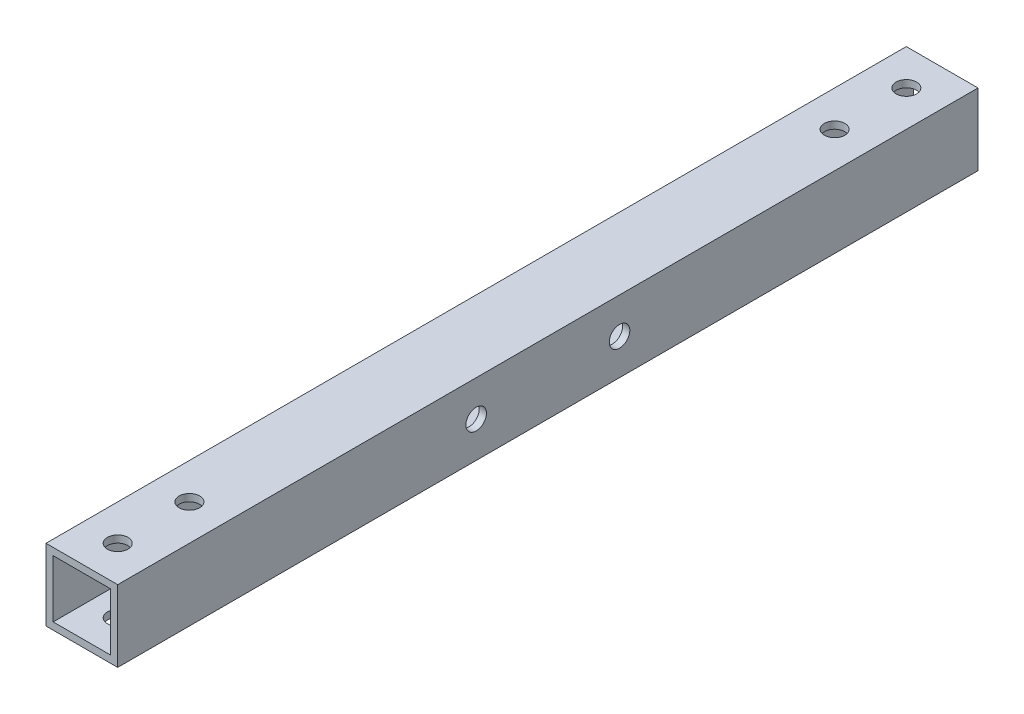
ISO-10303-21;
HEADER;
FILE_DESCRIPTION(('STEP AP214'),'2;1');
FILE_NAME('part.step','',(''),(''),'','','');
FILE_SCHEMA(('AUTOMOTIVE_DESIGN { 1 0 10303 214 1 1 1 1 }'));
ENDSEC;
DATA;
#1=APPLICATION_CONTEXT('core data for automotive mechanical design processes');
#2=APPLICATION_PROTOCOL_DEFINITION('international standard','automotive_design',2000,#1);
#3=PRODUCT_CONTEXT('',#1,'mechanical');
#4=PRODUCT('Part','Part','',(#3));
#5=PRODUCT_RELATED_PRODUCT_CATEGORY('part','',(#4));
#6=PRODUCT_DEFINITION_FORMATION('','',#4);
#7=PRODUCT_DEFINITION_CONTEXT('part definition',#1,'design');
#8=PRODUCT_DEFINITION('design','',#6,#7);
#9=PRODUCT_DEFINITION_SHAPE('','',#8);
#10=(LENGTH_UNIT() NAMED_UNIT(*) SI_UNIT(.MILLI.,.METRE.));
#11=(NAMED_UNIT(*) PLANE_ANGLE_UNIT() SI_UNIT($,.RADIAN.));
#12=(NAMED_UNIT(*) SI_UNIT($,.STERADIAN.) SOLID_ANGLE_UNIT());
#13=UNCERTAINTY_MEASURE_WITH_UNIT(LENGTH_MEASURE(1.E-05),#10,'distance_accuracy_value','');
#14=(GEOMETRIC_REPRESENTATION_CONTEXT(3) GLOBAL_UNCERTAINTY_ASSIGNED_CONTEXT((#13)) GLOBAL_UNIT_ASSIGNED_CONTEXT((#10,
#11,#12)) REPRESENTATION_CONTEXT('',''));
#15=CARTESIAN_POINT('',(0.,0.,0.));
#16=DIRECTION('',(0.,0.,1.));
#17=DIRECTION('',(1.,0.,0.));
#18=AXIS2_PLACEMENT_3D('',#15,#16,#17);
#19=CARTESIAN_POINT('',(-7.5,7.5,180.));
#20=DIRECTION('',(0.,-1.,0.));
#21=DIRECTION('',(0.,0.,-1.));
#22=AXIS2_PLACEMENT_3D('',#19,#20,#21);
#23=PLANE('',#22);
#24=CARTESIAN_POINT('',(0.,7.5,7.5));
#25=DIRECTION('',(0.,1.,0.));
#26=DIRECTION('',(0.,0.,1.));
#27=AXIS2_PLACEMENT_3D('',#24,#25,#26);
#28=CIRCLE('',#27,2.15);
#29=CARTESIAN_POINT('',(0.,7.5,9.65));
#30=VERTEX_POINT('',#29);
#31=EDGE_CURVE('E296',#30,#30,#28,.T.);
#32=ORIENTED_EDGE('',*,*,#31,.F.);
#33=EDGE_LOOP('',(#32));
#34=FACE_BOUND('',#33,.T.);
#35=CARTESIAN_POINT('',(0.,7.5,22.5));
#36=DIRECTION('',(0.,1.,0.));
#37=DIRECTION('',(0.,0.,1.));
#38=AXIS2_PLACEMENT_3D('',#35,#36,#37);
#39=CIRCLE('',#38,2.15);
#40=CARTESIAN_POINT('',(0.,7.5,24.65));
#41=VERTEX_POINT('',#40);
#42=EDGE_CURVE('E299',#41,#41,#39,.T.);
#43=ORIENTED_EDGE('',*,*,#42,.F.);
#44=EDGE_LOOP('',(#43));
#45=FACE_BOUND('',#44,.T.);
#46=DIRECTION('',(-1.,0.,0.));
#47=VECTOR('',#46,1.);
#48=CARTESIAN_POINT('',(-7.5,7.5,0.));
#49=LINE('',#48,#47);
#50=CARTESIAN_POINT('',(7.5,7.5,0.));
#51=VERTEX_POINT('',#50);
#52=CARTESIAN_POINT('',(-7.5,7.5,0.));
#53=VERTEX_POINT('',#52);
#54=EDGE_CURVE('E179',#51,#53,#49,.T.);
#55=ORIENTED_EDGE('',*,*,#54,.T.);
#56=DIRECTION('',(0.,0.,-1.));
#57=VECTOR('',#56,1.);
#58=CARTESIAN_POINT('',(-7.5,7.5,180.));
#59=LINE('',#58,#57);
#60=CARTESIAN_POINT('',(-7.5,7.5,180.));
#61=VERTEX_POINT('',#60);
#62=EDGE_CURVE('E68',#61,#53,#59,.T.);
#63=ORIENTED_EDGE('',*,*,#62,.F.);
#64=DIRECTION('',(-1.,0.,0.));
#65=VECTOR('',#64,1.);
#66=CARTESIAN_POINT('',(-7.5,7.5,180.));
#67=LINE('',#66,#65);
#68=CARTESIAN_POINT('',(7.5,7.5,180.));
#69=VERTEX_POINT('',#68);
#70=EDGE_CURVE('E169',#69,#61,#67,.T.);
#71=ORIENTED_EDGE('',*,*,#70,.F.);
#72=DIRECTION('',(0.,0.,-1.));
#73=VECTOR('',#72,1.);
#74=CARTESIAN_POINT('',(7.5,7.5,180.));
#75=LINE('',#74,#73);
#76=EDGE_CURVE('E12',#69,#51,#75,.T.);
#77=ORIENTED_EDGE('',*,*,#76,.T.);
#78=EDGE_LOOP('',(#55,#63,#71,#77));
#79=FACE_BOUND('',#78,.T.);
#80=CARTESIAN_POINT('',(0.,7.5,172.5));
#81=DIRECTION('',(0.,1.,0.));
#82=DIRECTION('',(0.,0.,1.));
#83=AXIS2_PLACEMENT_3D('',#80,#81,#82);
#84=CIRCLE('',#83,2.15000000000002);
#85=CARTESIAN_POINT('',(0.,7.5,174.65));
#86=VERTEX_POINT('',#85);
#87=EDGE_CURVE('E307',#86,#86,#84,.F.);
#88=ORIENTED_EDGE('',*,*,#87,.T.);
#89=EDGE_LOOP('',(#88));
#90=FACE_BOUND('',#89,.T.);
#91=CARTESIAN_POINT('',(0.,7.5,157.5));
#92=DIRECTION('',(0.,1.,0.));
#93=DIRECTION('',(0.,0.,1.));
#94=AXIS2_PLACEMENT_3D('',#91,#92,#93);
#95=CIRCLE('',#94,2.14999999999998);
#96=CARTESIAN_POINT('',(0.,7.5,159.65));
#97=VERTEX_POINT('',#96);
#98=EDGE_CURVE('E314',#97,#97,#95,.F.);
#99=ORIENTED_EDGE('',*,*,#98,.T.);
#100=EDGE_LOOP('',(#99));
#101=FACE_BOUND('',#100,.T.);
#102=ADVANCED_FACE('F59',(#34,#45,#79,#90,#101),#23,.F.);
#103=CARTESIAN_POINT('',(-7.5,-7.5,180.));
#104=DIRECTION('',(0.,1.,0.));
#105=DIRECTION('',(0.,0.,1.));
#106=AXIS2_PLACEMENT_3D('',#103,#104,#105);
#107=PLANE('',#106);
#108=CARTESIAN_POINT('',(0.,-7.5,7.5));
#109=DIRECTION('',(0.,1.,0.));
#110=DIRECTION('',(0.,0.,1.));
#111=AXIS2_PLACEMENT_3D('',#108,#109,#110);
#112=CIRCLE('',#111,2.15);
#113=CARTESIAN_POINT('',(0.,-7.5,9.65));
#114=VERTEX_POINT('',#113);
#115=EDGE_CURVE('E203',#114,#114,#112,.T.);
#116=ORIENTED_EDGE('',*,*,#115,.T.);
#117=EDGE_LOOP('',(#116));
#118=FACE_BOUND('',#117,.T.);
#119=CARTESIAN_POINT('',(0.,-7.5,22.5));
#120=DIRECTION('',(0.,1.,0.));
#121=DIRECTION('',(0.,0.,1.));
#122=AXIS2_PLACEMENT_3D('',#119,#120,#121);
#123=CIRCLE('',#122,2.15);
#124=CARTESIAN_POINT('',(0.,-7.5,24.65));
#125=VERTEX_POINT('',#124);
#126=EDGE_CURVE('E301',#125,#125,#123,.T.);
#127=ORIENTED_EDGE('',*,*,#126,.T.);
#128=EDGE_LOOP('',(#127));
#129=FACE_BOUND('',#128,.T.);
#130=DIRECTION('',(1.,0.,0.));
#131=VECTOR('',#130,1.);
#132=CARTESIAN_POINT('',(-7.5,-7.5,0.));
#133=LINE('',#132,#131);
#134=CARTESIAN_POINT('',(-7.5,-7.5,0.));
#135=VERTEX_POINT('',#134);
#136=CARTESIAN_POINT('',(7.5,-7.5,0.));
#137=VERTEX_POINT('',#136);
#138=EDGE_CURVE('E170',#135,#137,#133,.T.);
#139=ORIENTED_EDGE('',*,*,#138,.T.);
#140=DIRECTION('',(0.,0.,-1.));
#141=VECTOR('',#140,1.);
#142=CARTESIAN_POINT('',(7.5,-7.5,180.));
#143=LINE('',#142,#141);
#144=CARTESIAN_POINT('',(7.5,-7.5,180.));
#145=VERTEX_POINT('',#144);
#146=EDGE_CURVE('E176',#145,#137,#143,.T.);
#147=ORIENTED_EDGE('',*,*,#146,.F.);
#148=DIRECTION('',(1.,0.,0.));
#149=VECTOR('',#148,1.);
#150=CARTESIAN_POINT('',(-7.5,-7.5,180.));
#151=LINE('',#150,#149);
#152=CARTESIAN_POINT('',(-7.5,-7.5,180.));
#153=VERTEX_POINT('',#152);
#154=EDGE_CURVE('E174',#153,#145,#151,.T.);
#155=ORIENTED_EDGE('',*,*,#154,.F.);
#156=DIRECTION('',(0.,0.,-1.));
#157=VECTOR('',#156,1.);
#158=CARTESIAN_POINT('',(-7.5,-7.5,180.));
#159=LINE('',#158,#157);
#160=EDGE_CURVE('E186',#153,#135,#159,.T.);
#161=ORIENTED_EDGE('',*,*,#160,.T.);
#162=EDGE_LOOP('',(#139,#147,#155,#161));
#163=FACE_BOUND('',#162,.T.);
#164=CARTESIAN_POINT('',(0.,-7.5,172.5));
#165=DIRECTION('',(0.,1.,0.));
#166=DIRECTION('',(0.,0.,1.));
#167=AXIS2_PLACEMENT_3D('',#164,#165,#166);
#168=CIRCLE('',#167,2.15000000000002);
#169=CARTESIAN_POINT('',(0.,-7.5,174.65));
#170=VERTEX_POINT('',#169);
#171=EDGE_CURVE('E302',#170,#170,#168,.F.);
#172=ORIENTED_EDGE('',*,*,#171,.F.);
#173=EDGE_LOOP('',(#172));
#174=FACE_BOUND('',#173,.T.);
#175=CARTESIAN_POINT('',(0.,-7.5,157.5));
#176=DIRECTION('',(0.,1.,0.));
#177=DIRECTION('',(0.,0.,1.));
#178=AXIS2_PLACEMENT_3D('',#175,#176,#177);
#179=CIRCLE('',#178,2.14999999999998);
#180=CARTESIAN_POINT('',(0.,-7.5,159.65));
#181=VERTEX_POINT('',#180);
#182=EDGE_CURVE('E311',#181,#181,#179,.F.);
#183=ORIENTED_EDGE('',*,*,#182,.F.);
#184=EDGE_LOOP('',(#183));
#185=FACE_BOUND('',#184,.T.);
#186=ADVANCED_FACE('F277',(#118,#129,#163,#174,#185),#107,.F.);
#187=CARTESIAN_POINT('',(-7.5,6.,180.));
#188=DIRECTION('',(0.,-1.,0.));
#189=DIRECTION('',(0.,0.,-1.));
#190=AXIS2_PLACEMENT_3D('',#187,#188,#189);
#191=PLANE('',#190);
#192=CARTESIAN_POINT('',(0.,6.,7.5));
#193=DIRECTION('',(0.,-1.,0.));
#194=DIRECTION('',(0.,0.,-1.));
#195=AXIS2_PLACEMENT_3D('',#192,#193,#194);
#196=CIRCLE('',#195,2.15);
#197=CARTESIAN_POINT('',(0.,6.,5.35));
#198=VERTEX_POINT('',#197);
#199=EDGE_CURVE('E221',#198,#198,#196,.T.);
#200=ORIENTED_EDGE('',*,*,#199,.F.);
#201=EDGE_LOOP('',(#200));
#202=FACE_BOUND('',#201,.T.);
#203=CARTESIAN_POINT('',(0.,6.,172.5));
#204=DIRECTION('',(0.,-1.,0.));
#205=DIRECTION('',(0.,0.,-1.));
#206=AXIS2_PLACEMENT_3D('',#203,#204,#205);
#207=CIRCLE('',#206,2.15000000000002);
#208=CARTESIAN_POINT('',(0.,6.,170.35));
#209=VERTEX_POINT('',#208);
#210=EDGE_CURVE('E206',#209,#209,#207,.F.);
#211=ORIENTED_EDGE('',*,*,#210,.T.);
#212=EDGE_LOOP('',(#211));
#213=FACE_BOUND('',#212,.T.);
#214=CARTESIAN_POINT('',(0.,6.,22.5));
#215=DIRECTION('',(0.,-1.,0.));
#216=DIRECTION('',(0.,0.,-1.));
#217=AXIS2_PLACEMENT_3D('',#214,#215,#216);
#218=CIRCLE('',#217,2.15);
#219=CARTESIAN_POINT('',(0.,6.,20.35));
#220=VERTEX_POINT('',#219);
#221=EDGE_CURVE('E202',#220,#220,#218,.T.);
#222=ORIENTED_EDGE('',*,*,#221,.F.);
#223=EDGE_LOOP('',(#222));
#224=FACE_BOUND('',#223,.T.);
#225=DIRECTION('',(-1.,0.,0.));
#226=VECTOR('',#225,1.);
#227=CARTESIAN_POINT('',(-7.5,6.,0.));
#228=LINE('',#227,#226);
#229=CARTESIAN_POINT('',(6.,6.,0.));
#230=VERTEX_POINT('',#229);
#231=CARTESIAN_POINT('',(-6.,6.,0.));
#232=VERTEX_POINT('',#231);
#233=EDGE_CURVE('E142',#230,#232,#228,.T.);
#234=ORIENTED_EDGE('',*,*,#233,.F.);
#235=DIRECTION('',(0.,0.,-1.));
#236=VECTOR('',#235,1.);
#237=CARTESIAN_POINT('',(6.,6.,180.));
#238=LINE('',#237,#236);
#239=CARTESIAN_POINT('',(6.,6.,180.));
#240=VERTEX_POINT('',#239);
#241=EDGE_CURVE('E129',#240,#230,#238,.T.);
#242=ORIENTED_EDGE('',*,*,#241,.F.);
#243=DIRECTION('',(-1.,0.,0.));
#244=VECTOR('',#243,1.);
#245=CARTESIAN_POINT('',(-7.5,6.,180.));
#246=LINE('',#245,#244);
#247=CARTESIAN_POINT('',(-6.,6.,180.));
#248=VERTEX_POINT('',#247);
#249=EDGE_CURVE('E134',#240,#248,#246,.T.);
#250=ORIENTED_EDGE('',*,*,#249,.T.);
#251=DIRECTION('',(0.,0.,-1.));
#252=VECTOR('',#251,1.);
#253=CARTESIAN_POINT('',(-6.,6.,180.));
#254=LINE('',#253,#252);
#255=EDGE_CURVE('E144',#248,#232,#254,.T.);
#256=ORIENTED_EDGE('',*,*,#255,.T.);
#257=EDGE_LOOP('',(#234,#242,#250,#256));
#258=FACE_BOUND('',#257,.T.);
#259=CARTESIAN_POINT('',(0.,6.,157.5));
#260=DIRECTION('',(0.,-1.,0.));
#261=DIRECTION('',(0.,0.,-1.));
#262=AXIS2_PLACEMENT_3D('',#259,#260,#261);
#263=CIRCLE('',#262,2.14999999999998);
#264=CARTESIAN_POINT('',(0.,6.,155.35));
#265=VERTEX_POINT('',#264);
#266=EDGE_CURVE('E209',#265,#265,#263,.F.);
#267=ORIENTED_EDGE('',*,*,#266,.T.);
#268=EDGE_LOOP('',(#267));
#269=FACE_BOUND('',#268,.T.);
#270=ADVANCED_FACE('F138',(#202,#213,#224,#258,#269),#191,.T.);
#271=CARTESIAN_POINT('',(-7.5,-6.,180.));
#272=DIRECTION('',(0.,1.,0.));
#273=DIRECTION('',(0.,0.,1.));
#274=AXIS2_PLACEMENT_3D('',#271,#272,#273);
#275=PLANE('',#274);
#276=CARTESIAN_POINT('',(0.,-6.,7.5));
#277=DIRECTION('',(0.,1.,0.));
#278=DIRECTION('',(0.,0.,1.));
#279=AXIS2_PLACEMENT_3D('',#276,#277,#278);
#280=CIRCLE('',#279,2.15);
#281=CARTESIAN_POINT('',(0.,-6.,9.65));
#282=VERTEX_POINT('',#281);
#283=EDGE_CURVE('E63',#282,#282,#280,.T.);
#284=ORIENTED_EDGE('',*,*,#283,.F.);
#285=EDGE_LOOP('',(#284));
#286=FACE_BOUND('',#285,.T.);
#287=CARTESIAN_POINT('',(0.,-6.,172.5));
#288=DIRECTION('',(0.,1.,0.));
#289=DIRECTION('',(0.,0.,1.));
#290=AXIS2_PLACEMENT_3D('',#287,#288,#289);
#291=CIRCLE('',#290,2.15000000000002);
#292=CARTESIAN_POINT('',(0.,-6.,174.65));
#293=VERTEX_POINT('',#292);
#294=EDGE_CURVE('E204',#293,#293,#291,.F.);
#295=ORIENTED_EDGE('',*,*,#294,.T.);
#296=EDGE_LOOP('',(#295));
#297=FACE_BOUND('',#296,.T.);
#298=CARTESIAN_POINT('',(0.,-6.,22.5));
#299=DIRECTION('',(0.,1.,0.));
#300=DIRECTION('',(0.,0.,1.));
#301=AXIS2_PLACEMENT_3D('',#298,#299,#300);
#302=CIRCLE('',#301,2.15);
#303=CARTESIAN_POINT('',(0.,-6.,24.65));
#304=VERTEX_POINT('',#303);
#305=EDGE_CURVE('E199',#304,#304,#302,.T.);
#306=ORIENTED_EDGE('',*,*,#305,.F.);
#307=EDGE_LOOP('',(#306));
#308=FACE_BOUND('',#307,.T.);
#309=DIRECTION('',(1.,0.,0.));
#310=VECTOR('',#309,1.);
#311=CARTESIAN_POINT('',(-7.5,-6.,0.));
#312=LINE('',#311,#310);
#313=CARTESIAN_POINT('',(-5.99999999999999,-6.,0.));
#314=VERTEX_POINT('',#313);
#315=CARTESIAN_POINT('',(6.,-6.,0.));
#316=VERTEX_POINT('',#315);
#317=EDGE_CURVE('E135',#314,#316,#312,.T.);
#318=ORIENTED_EDGE('',*,*,#317,.F.);
#319=DIRECTION('',(0.,0.,-1.));
#320=VECTOR('',#319,1.);
#321=CARTESIAN_POINT('',(-5.99999999999999,-6.,180.));
#322=LINE('',#321,#320);
#323=CARTESIAN_POINT('',(-5.99999999999999,-6.,180.));
#324=VERTEX_POINT('',#323);
#325=EDGE_CURVE('E76',#324,#314,#322,.T.);
#326=ORIENTED_EDGE('',*,*,#325,.F.);
#327=DIRECTION('',(1.,0.,0.));
#328=VECTOR('',#327,1.);
#329=CARTESIAN_POINT('',(-7.5,-6.,180.));
#330=LINE('',#329,#328);
#331=CARTESIAN_POINT('',(6.,-6.,180.));
#332=VERTEX_POINT('',#331);
#333=EDGE_CURVE('E150',#324,#332,#330,.T.);
#334=ORIENTED_EDGE('',*,*,#333,.T.);
#335=DIRECTION('',(0.,0.,-1.));
#336=VECTOR('',#335,1.);
#337=CARTESIAN_POINT('',(6.,-6.,180.));
#338=LINE('',#337,#336);
#339=EDGE_CURVE('E130',#332,#316,#338,.T.);
#340=ORIENTED_EDGE('',*,*,#339,.T.);
#341=EDGE_LOOP('',(#318,#326,#334,#340));
#342=FACE_BOUND('',#341,.T.);
#343=CARTESIAN_POINT('',(0.,-6.,157.5));
#344=DIRECTION('',(0.,1.,0.));
#345=DIRECTION('',(0.,0.,1.));
#346=AXIS2_PLACEMENT_3D('',#343,#344,#345);
#347=CIRCLE('',#346,2.14999999999998);
#348=CARTESIAN_POINT('',(0.,-6.,159.65));
#349=VERTEX_POINT('',#348);
#350=EDGE_CURVE('E207',#349,#349,#347,.F.);
#351=ORIENTED_EDGE('',*,*,#350,.T.);
#352=EDGE_LOOP('',(#351));
#353=FACE_BOUND('',#352,.T.);
#354=ADVANCED_FACE('F355',(#286,#297,#308,#342,#353),#275,.T.);
#355=CARTESIAN_POINT('',(0.,0.,180.));
#356=DIRECTION('',(0.,0.,1.));
#357=DIRECTION('',(1.,0.,0.));
#358=AXIS2_PLACEMENT_3D('',#355,#356,#357);
#359=PLANE('',#358);
#360=DIRECTION('',(0.,1.,0.));
#361=VECTOR('',#360,1.);
#362=CARTESIAN_POINT('',(7.5,7.5,180.));
#363=LINE('',#362,#361);
#364=EDGE_CURVE('E166',#145,#69,#363,.T.);
#365=ORIENTED_EDGE('',*,*,#364,.T.);
#366=ORIENTED_EDGE('',*,*,#70,.T.);
#367=DIRECTION('',(0.,-1.,0.));
#368=VECTOR('',#367,1.);
#369=CARTESIAN_POINT('',(-7.5,7.5,180.));
#370=LINE('',#369,#368);
#371=EDGE_CURVE('E172',#61,#153,#370,.T.);
#372=ORIENTED_EDGE('',*,*,#371,.T.);
#373=ORIENTED_EDGE('',*,*,#154,.T.);
#374=EDGE_LOOP('',(#365,#366,#372,#373));
#375=FACE_BOUND('',#374,.T.);
#376=ORIENTED_EDGE('',*,*,#249,.F.);
#377=DIRECTION('',(0.,1.,0.));
#378=VECTOR('',#377,1.);
#379=CARTESIAN_POINT('',(6.,7.5,180.));
#380=LINE('',#379,#378);
#381=EDGE_CURVE('E126',#332,#240,#380,.T.);
#382=ORIENTED_EDGE('',*,*,#381,.F.);
#383=ORIENTED_EDGE('',*,*,#333,.F.);
#384=DIRECTION('',(0.,-1.,0.));
#385=VECTOR('',#384,1.);
#386=CARTESIAN_POINT('',(-6.,7.5,180.));
#387=LINE('',#386,#385);
#388=EDGE_CURVE('E148',#248,#324,#387,.T.);
#389=ORIENTED_EDGE('',*,*,#388,.F.);
#390=EDGE_LOOP('',(#376,#382,#383,#389));
#391=FACE_BOUND('',#390,.T.);
#392=ADVANCED_FACE('F147',(#375,#391),#359,.T.);
#393=CARTESIAN_POINT('',(0.,0.,0.));
#394=DIRECTION('',(0.,0.,1.));
#395=DIRECTION('',(1.,0.,0.));
#396=AXIS2_PLACEMENT_3D('',#393,#394,#395);
#397=PLANE('',#396);
#398=DIRECTION('',(0.,1.,0.));
#399=VECTOR('',#398,1.);
#400=CARTESIAN_POINT('',(7.5,7.5,0.));
#401=LINE('',#400,#399);
#402=EDGE_CURVE('E143',#137,#51,#401,.T.);
#403=ORIENTED_EDGE('',*,*,#402,.F.);
#404=ORIENTED_EDGE('',*,*,#138,.F.);
#405=DIRECTION('',(0.,-1.,0.));
#406=VECTOR('',#405,1.);
#407=CARTESIAN_POINT('',(-7.5,7.5,0.));
#408=LINE('',#407,#406);
#409=EDGE_CURVE('E181',#53,#135,#408,.T.);
#410=ORIENTED_EDGE('',*,*,#409,.F.);
#411=ORIENTED_EDGE('',*,*,#54,.F.);
#412=EDGE_LOOP('',(#403,#404,#410,#411));
#413=FACE_BOUND('',#412,.T.);
#414=DIRECTION('',(0.,1.,0.));
#415=VECTOR('',#414,1.);
#416=CARTESIAN_POINT('',(6.,7.5,0.));
#417=LINE('',#416,#415);
#418=EDGE_CURVE('E84',#316,#230,#417,.T.);
#419=ORIENTED_EDGE('',*,*,#418,.T.);
#420=ORIENTED_EDGE('',*,*,#233,.T.);
#421=DIRECTION('',(0.,-1.,0.));
#422=VECTOR('',#421,1.);
#423=CARTESIAN_POINT('',(-6.,7.5,0.));
#424=LINE('',#423,#422);
#425=EDGE_CURVE('E158',#232,#314,#424,.T.);
#426=ORIENTED_EDGE('',*,*,#425,.T.);
#427=ORIENTED_EDGE('',*,*,#317,.T.);
#428=EDGE_LOOP('',(#419,#420,#426,#427));
#429=FACE_BOUND('',#428,.T.);
#430=ADVANCED_FACE('F259',(#413,#429),#397,.F.);
#431=CARTESIAN_POINT('',(7.5,7.5,180.));
#432=DIRECTION('',(-1.,0.,0.));
#433=DIRECTION('',(0.,-1.,0.));
#434=AXIS2_PLACEMENT_3D('',#431,#432,#433);
#435=PLANE('',#434);
#436=CARTESIAN_POINT('',(7.5,0.,75.));
#437=DIRECTION('',(1.,0.,0.));
#438=DIRECTION('',(0.,0.,-1.));
#439=AXIS2_PLACEMENT_3D('',#436,#437,#438);
#440=CIRCLE('',#439,2.15);
#441=CARTESIAN_POINT('',(7.5,0.,72.85));
#442=VERTEX_POINT('',#441);
#443=EDGE_CURVE('E227',#442,#442,#440,.T.);
#444=ORIENTED_EDGE('',*,*,#443,.F.);
#445=EDGE_LOOP('',(#444));
#446=FACE_BOUND('',#445,.T.);
#447=CARTESIAN_POINT('',(7.5,0.,105.));
#448=DIRECTION('',(1.,0.,0.));
#449=DIRECTION('',(0.,0.,1.));
#450=AXIS2_PLACEMENT_3D('',#447,#448,#449);
#451=CIRCLE('',#450,2.15000000000002);
#452=CARTESIAN_POINT('',(7.5,0.,102.85));
#453=VERTEX_POINT('',#452);
#454=EDGE_CURVE('E224',#453,#453,#451,.T.);
#455=ORIENTED_EDGE('',*,*,#454,.F.);
#456=EDGE_LOOP('',(#455));
#457=FACE_BOUND('',#456,.T.);
#458=ORIENTED_EDGE('',*,*,#402,.T.);
#459=ORIENTED_EDGE('',*,*,#76,.F.);
#460=ORIENTED_EDGE('',*,*,#364,.F.);
#461=ORIENTED_EDGE('',*,*,#146,.T.);
#462=EDGE_LOOP('',(#458,#459,#460,#461));
#463=FACE_BOUND('',#462,.T.);
#464=ADVANCED_FACE('F61',(#446,#457,#463),#435,.F.);
#465=CARTESIAN_POINT('',(-7.5,7.5,180.));
#466=DIRECTION('',(1.,0.,0.));
#467=DIRECTION('',(0.,1.,0.));
#468=AXIS2_PLACEMENT_3D('',#465,#466,#467);
#469=PLANE('',#468);
#470=CARTESIAN_POINT('',(-7.5,0.,75.));
#471=DIRECTION('',(1.,0.,0.));
#472=DIRECTION('',(0.,0.,-1.));
#473=AXIS2_PLACEMENT_3D('',#470,#471,#472);
#474=CIRCLE('',#473,2.15);
#475=CARTESIAN_POINT('',(-7.5,0.,72.85));
#476=VERTEX_POINT('',#475);
#477=EDGE_CURVE('E195',#476,#476,#474,.T.);
#478=ORIENTED_EDGE('',*,*,#477,.T.);
#479=EDGE_LOOP('',(#478));
#480=FACE_BOUND('',#479,.T.);
#481=CARTESIAN_POINT('',(-7.5,0.,105.));
#482=DIRECTION('',(1.,0.,0.));
#483=DIRECTION('',(0.,0.,1.));
#484=AXIS2_PLACEMENT_3D('',#481,#482,#483);
#485=CIRCLE('',#484,2.15000000000002);
#486=CARTESIAN_POINT('',(-7.5,0.,102.85));
#487=VERTEX_POINT('',#486);
#488=EDGE_CURVE('E230',#487,#487,#485,.T.);
#489=ORIENTED_EDGE('',*,*,#488,.T.);
#490=EDGE_LOOP('',(#489));
#491=FACE_BOUND('',#490,.T.);
#492=ORIENTED_EDGE('',*,*,#409,.T.);
#493=ORIENTED_EDGE('',*,*,#160,.F.);
#494=ORIENTED_EDGE('',*,*,#371,.F.);
#495=ORIENTED_EDGE('',*,*,#62,.T.);
#496=EDGE_LOOP('',(#492,#493,#494,#495));
#497=FACE_BOUND('',#496,.T.);
#498=ADVANCED_FACE('F245',(#480,#491,#497),#469,.F.);
#499=CARTESIAN_POINT('',(6.,7.5,180.));
#500=DIRECTION('',(-1.,0.,0.));
#501=DIRECTION('',(0.,-1.,0.));
#502=AXIS2_PLACEMENT_3D('',#499,#500,#501);
#503=PLANE('',#502);
#504=CARTESIAN_POINT('',(6.,0.,75.));
#505=DIRECTION('',(-1.,0.,0.));
#506=DIRECTION('',(0.,-1.,0.));
#507=AXIS2_PLACEMENT_3D('',#504,#505,#506);
#508=CIRCLE('',#507,2.15);
#509=CARTESIAN_POINT('',(6.,0.,72.85));
#510=VERTEX_POINT('',#509);
#511=EDGE_CURVE('E156',#510,#510,#508,.T.);
#512=ORIENTED_EDGE('',*,*,#511,.F.);
#513=EDGE_LOOP('',(#512));
#514=FACE_BOUND('',#513,.T.);
#515=CARTESIAN_POINT('',(6.,0.,105.));
#516=DIRECTION('',(-1.,0.,0.));
#517=DIRECTION('',(0.,-1.,0.));
#518=AXIS2_PLACEMENT_3D('',#515,#516,#517);
#519=CIRCLE('',#518,2.15000000000002);
#520=CARTESIAN_POINT('',(6.,0.,102.85));
#521=VERTEX_POINT('',#520);
#522=EDGE_CURVE('E194',#521,#521,#519,.T.);
#523=ORIENTED_EDGE('',*,*,#522,.F.);
#524=EDGE_LOOP('',(#523));
#525=FACE_BOUND('',#524,.T.);
#526=ORIENTED_EDGE('',*,*,#418,.F.);
#527=ORIENTED_EDGE('',*,*,#339,.F.);
#528=ORIENTED_EDGE('',*,*,#381,.T.);
#529=ORIENTED_EDGE('',*,*,#241,.T.);
#530=EDGE_LOOP('',(#526,#527,#528,#529));
#531=FACE_BOUND('',#530,.T.);
#532=ADVANCED_FACE('F128',(#514,#525,#531),#503,.T.);
#533=CARTESIAN_POINT('',(-6.,7.5,180.));
#534=DIRECTION('',(1.,0.,0.));
#535=DIRECTION('',(0.,1.,0.));
#536=AXIS2_PLACEMENT_3D('',#533,#534,#535);
#537=PLANE('',#536);
#538=CARTESIAN_POINT('',(-6.,0.,75.));
#539=DIRECTION('',(1.,0.,0.));
#540=DIRECTION('',(0.,1.,0.));
#541=AXIS2_PLACEMENT_3D('',#538,#539,#540);
#542=CIRCLE('',#541,2.15);
#543=CARTESIAN_POINT('',(-6.,0.,72.85));
#544=VERTEX_POINT('',#543);
#545=EDGE_CURVE('E196',#544,#544,#542,.T.);
#546=ORIENTED_EDGE('',*,*,#545,.F.);
#547=EDGE_LOOP('',(#546));
#548=FACE_BOUND('',#547,.T.);
#549=CARTESIAN_POINT('',(-6.,0.,105.));
#550=DIRECTION('',(1.,0.,0.));
#551=DIRECTION('',(0.,1.,0.));
#552=AXIS2_PLACEMENT_3D('',#549,#550,#551);
#553=CIRCLE('',#552,2.15000000000002);
#554=CARTESIAN_POINT('',(-6.,0.,102.85));
#555=VERTEX_POINT('',#554);
#556=EDGE_CURVE('E191',#555,#555,#553,.T.);
#557=ORIENTED_EDGE('',*,*,#556,.F.);
#558=EDGE_LOOP('',(#557));
#559=FACE_BOUND('',#558,.T.);
#560=ORIENTED_EDGE('',*,*,#425,.F.);
#561=ORIENTED_EDGE('',*,*,#255,.F.);
#562=ORIENTED_EDGE('',*,*,#388,.T.);
#563=ORIENTED_EDGE('',*,*,#325,.T.);
#564=EDGE_LOOP('',(#560,#561,#562,#563));
#565=FACE_BOUND('',#564,.T.);
#566=ADVANCED_FACE('F244',(#548,#559,#565),#537,.T.);
#567=CARTESIAN_POINT('',(-7.5,0.,105.));
#568=DIRECTION('',(1.,0.,0.));
#569=DIRECTION('',(0.,0.,-1.));
#570=AXIS2_PLACEMENT_3D('',#567,#568,#569);
#571=CYLINDRICAL_SURFACE('',#570,2.15000000000002);
#572=CARTESIAN_POINT('',(-6.,0.,102.85));
#573=CARTESIAN_POINT('',(-6.015625,0.,102.85));
#574=CARTESIAN_POINT('',(-6.03125,0.,102.85));
#575=CARTESIAN_POINT('',(-6.0625,0.,102.85));
#576=CARTESIAN_POINT('',(-6.078125,0.,102.85));
#577=CARTESIAN_POINT('',(-6.109375,0.,102.85));
#578=CARTESIAN_POINT('',(-6.125,0.,102.85));
#579=CARTESIAN_POINT('',(-6.15625,0.,102.85));
#580=CARTESIAN_POINT('',(-6.171875,0.,102.85));
#581=CARTESIAN_POINT('',(-6.203125,0.,102.85));
#582=CARTESIAN_POINT('',(-6.21875,0.,102.85));
#583=CARTESIAN_POINT('',(-6.25,0.,102.85));
#584=CARTESIAN_POINT('',(-6.265625,0.,102.85));
#585=CARTESIAN_POINT('',(-6.296875,0.,102.85));
#586=CARTESIAN_POINT('',(-6.3125,0.,102.85));
#587=CARTESIAN_POINT('',(-6.34375,0.,102.85));
#588=CARTESIAN_POINT('',(-6.359375,0.,102.85));
#589=CARTESIAN_POINT('',(-6.390625,0.,102.85));
#590=CARTESIAN_POINT('',(-6.40625,0.,102.85));
#591=CARTESIAN_POINT('',(-6.4375,0.,102.85));
#592=CARTESIAN_POINT('',(-6.453125,0.,102.85));
#593=CARTESIAN_POINT('',(-6.484375,0.,102.85));
#594=CARTESIAN_POINT('',(-6.5,0.,102.85));
#595=CARTESIAN_POINT('',(-6.53125,0.,102.85));
#596=CARTESIAN_POINT('',(-6.546875,0.,102.85));
#597=CARTESIAN_POINT('',(-6.578125,0.,102.85));
#598=CARTESIAN_POINT('',(-6.59375,0.,102.85));
#599=CARTESIAN_POINT('',(-6.625,0.,102.85));
#600=CARTESIAN_POINT('',(-6.640625,0.,102.85));
#601=CARTESIAN_POINT('',(-6.671875,0.,102.85));
#602=CARTESIAN_POINT('',(-6.6875,0.,102.85));
#603=CARTESIAN_POINT('',(-6.71875,0.,102.85));
#604=CARTESIAN_POINT('',(-6.734375,0.,102.85));
#605=CARTESIAN_POINT('',(-6.765625,0.,102.85));
#606=CARTESIAN_POINT('',(-6.78125,0.,102.85));
#607=CARTESIAN_POINT('',(-6.8125,0.,102.85));
#608=CARTESIAN_POINT('',(-6.828125,0.,102.85));
#609=CARTESIAN_POINT('',(-6.859375,0.,102.85));
#610=CARTESIAN_POINT('',(-6.875,0.,102.85));
#611=CARTESIAN_POINT('',(-6.90625,0.,102.85));
#612=CARTESIAN_POINT('',(-6.921875,0.,102.85));
#613=CARTESIAN_POINT('',(-6.953125,0.,102.85));
#614=CARTESIAN_POINT('',(-6.96875,0.,102.85));
#615=CARTESIAN_POINT('',(-7.,0.,102.85));
#616=CARTESIAN_POINT('',(-7.015625,0.,102.85));
#617=CARTESIAN_POINT('',(-7.046875,0.,102.85));
#618=CARTESIAN_POINT('',(-7.0625,0.,102.85));
#619=CARTESIAN_POINT('',(-7.09375,0.,102.85));
#620=CARTESIAN_POINT('',(-7.109375,0.,102.85));
#621=CARTESIAN_POINT('',(-7.140625,0.,102.85));
#622=CARTESIAN_POINT('',(-7.15625,0.,102.85));
#623=CARTESIAN_POINT('',(-7.1875,0.,102.85));
#624=CARTESIAN_POINT('',(-7.203125,0.,102.85));
#625=CARTESIAN_POINT('',(-7.234375,0.,102.85));
#626=CARTESIAN_POINT('',(-7.25,0.,102.85));
#627=CARTESIAN_POINT('',(-7.28125,0.,102.85));
#628=CARTESIAN_POINT('',(-7.296875,0.,102.85));
#629=CARTESIAN_POINT('',(-7.328125,0.,102.85));
#630=CARTESIAN_POINT('',(-7.34375,0.,102.85));
#631=CARTESIAN_POINT('',(-7.375,0.,102.85));
#632=CARTESIAN_POINT('',(-7.390625,0.,102.85));
#633=CARTESIAN_POINT('',(-7.421875,0.,102.85));
#634=CARTESIAN_POINT('',(-7.4375,0.,102.85));
#635=CARTESIAN_POINT('',(-7.46875,0.,102.85));
#636=CARTESIAN_POINT('',(-7.484375,0.,102.85));
#637=CARTESIAN_POINT('',(-7.5,0.,102.85));
#638=B_SPLINE_CURVE_WITH_KNOTS('',3,(#572,#573,#574,#575,#576,#577,#578,#579,#580,#581,#582,
#583,#584,#585,#586,#587,#588,#589,#590,#591,#592,#593,#594,#595,#596,#597,#598,#599,#600,#601,
#602,#603,#604,#605,#606,#607,#608,#609,#610,#611,#612,#613,#614,#615,#616,#617,#618,#619,#620,
#621,#622,#623,#624,#625,#626,#627,#628,#629,#630,#631,#632,#633,#634,#635,#636,#637),
.UNSPECIFIED.,.F.,.F.,(4,2,2,2,2,2,2,2,2,2,2,2,2,2,2,2,2,2,2,2,2,2,2,2,2,2,2,2,2,2,2,2,4),(0.,
0.046875,0.0937500000000001,0.140625,0.1875,0.234375,0.28125,0.328125,0.375,0.421875,0.46875,
0.515625,0.5625,0.609375000000001,0.656250000000001,0.703125000000001,0.750000000000001,
0.796875000000001,0.843750000000001,0.890625000000001,0.937500000000001,0.984375000000001,
1.03125,1.078125,1.125,1.171875,1.21875,1.265625,1.3125,1.359375,1.40625,1.453125,1.5),.UNSPECIFIED.);
#639=EDGE_CURVE('BSEAM254',#555,#487,#638,.T.);
#640=ORIENTED_EDGE('',*,*,#556,.T.);
#641=ORIENTED_EDGE('',*,*,#488,.F.);
#642=ORIENTED_EDGE('',*,*,#639,.T.);
#643=ORIENTED_EDGE('',*,*,#639,.F.);
#644=EDGE_LOOP('',(#640,#642,#641,#643));
#645=FACE_BOUND('',#644,.T.);
#646=ADVANCED_FACE('F254',(#645),#571,.F.);
#647=CARTESIAN_POINT('',(-7.5,0.,75.));
#648=DIRECTION('',(1.,0.,0.));
#649=DIRECTION('',(0.,0.,-1.));
#650=AXIS2_PLACEMENT_3D('',#647,#648,#649);
#651=CYLINDRICAL_SURFACE('',#650,2.15);
#652=CARTESIAN_POINT('',(-6.,0.,72.85));
#653=CARTESIAN_POINT('',(-6.015625,0.,72.85));
#654=CARTESIAN_POINT('',(-6.03125,0.,72.85));
#655=CARTESIAN_POINT('',(-6.0625,0.,72.85));
#656=CARTESIAN_POINT('',(-6.078125,0.,72.85));
#657=CARTESIAN_POINT('',(-6.109375,0.,72.85));
#658=CARTESIAN_POINT('',(-6.125,0.,72.85));
#659=CARTESIAN_POINT('',(-6.15625,0.,72.85));
#660=CARTESIAN_POINT('',(-6.171875,0.,72.85));
#661=CARTESIAN_POINT('',(-6.203125,0.,72.85));
#662=CARTESIAN_POINT('',(-6.21875,0.,72.85));
#663=CARTESIAN_POINT('',(-6.25,0.,72.85));
#664=CARTESIAN_POINT('',(-6.265625,0.,72.85));
#665=CARTESIAN_POINT('',(-6.296875,0.,72.85));
#666=CARTESIAN_POINT('',(-6.3125,0.,72.85));
#667=CARTESIAN_POINT('',(-6.34375,0.,72.85));
#668=CARTESIAN_POINT('',(-6.359375,0.,72.85));
#669=CARTESIAN_POINT('',(-6.390625,0.,72.85));
#670=CARTESIAN_POINT('',(-6.40625,0.,72.85));
#671=CARTESIAN_POINT('',(-6.4375,0.,72.85));
#672=CARTESIAN_POINT('',(-6.453125,0.,72.85));
#673=CARTESIAN_POINT('',(-6.484375,0.,72.85));
#674=CARTESIAN_POINT('',(-6.5,0.,72.85));
#675=CARTESIAN_POINT('',(-6.53125,0.,72.85));
#676=CARTESIAN_POINT('',(-6.546875,0.,72.85));
#677=CARTESIAN_POINT('',(-6.578125,0.,72.85));
#678=CARTESIAN_POINT('',(-6.59375,0.,72.85));
#679=CARTESIAN_POINT('',(-6.625,0.,72.85));
#680=CARTESIAN_POINT('',(-6.640625,0.,72.85));
#681=CARTESIAN_POINT('',(-6.671875,0.,72.85));
#682=CARTESIAN_POINT('',(-6.6875,0.,72.85));
#683=CARTESIAN_POINT('',(-6.71875,0.,72.85));
#684=CARTESIAN_POINT('',(-6.734375,0.,72.85));
#685=CARTESIAN_POINT('',(-6.765625,0.,72.85));
#686=CARTESIAN_POINT('',(-6.78125,0.,72.85));
#687=CARTESIAN_POINT('',(-6.8125,0.,72.85));
#688=CARTESIAN_POINT('',(-6.828125,0.,72.85));
#689=CARTESIAN_POINT('',(-6.859375,0.,72.85));
#690=CARTESIAN_POINT('',(-6.875,0.,72.85));
#691=CARTESIAN_POINT('',(-6.90625,0.,72.85));
#692=CARTESIAN_POINT('',(-6.921875,0.,72.85));
#693=CARTESIAN_POINT('',(-6.953125,0.,72.85));
#694=CARTESIAN_POINT('',(-6.96875,0.,72.85));
#695=CARTESIAN_POINT('',(-7.,0.,72.85));
#696=CARTESIAN_POINT('',(-7.015625,0.,72.85));
#697=CARTESIAN_POINT('',(-7.046875,0.,72.85));
#698=CARTESIAN_POINT('',(-7.0625,0.,72.85));
#699=CARTESIAN_POINT('',(-7.09375,0.,72.85));
#700=CARTESIAN_POINT('',(-7.109375,0.,72.85));
#701=CARTESIAN_POINT('',(-7.140625,0.,72.85));
#702=CARTESIAN_POINT('',(-7.15625,0.,72.85));
#703=CARTESIAN_POINT('',(-7.1875,0.,72.85));
#704=CARTESIAN_POINT('',(-7.203125,0.,72.85));
#705=CARTESIAN_POINT('',(-7.234375,0.,72.85));
#706=CARTESIAN_POINT('',(-7.25,0.,72.85));
#707=CARTESIAN_POINT('',(-7.28125,0.,72.85));
#708=CARTESIAN_POINT('',(-7.296875,0.,72.85));
#709=CARTESIAN_POINT('',(-7.328125,0.,72.85));
#710=CARTESIAN_POINT('',(-7.34375,0.,72.85));
#711=CARTESIAN_POINT('',(-7.375,0.,72.85));
#712=CARTESIAN_POINT('',(-7.390625,0.,72.85));
#713=CARTESIAN_POINT('',(-7.421875,0.,72.85));
#714=CARTESIAN_POINT('',(-7.4375,0.,72.85));
#715=CARTESIAN_POINT('',(-7.46875,0.,72.85));
#716=CARTESIAN_POINT('',(-7.484375,0.,72.85));
#717=CARTESIAN_POINT('',(-7.5,0.,72.85));
#718=B_SPLINE_CURVE_WITH_KNOTS('',3,(#652,#653,#654,#655,#656,#657,#658,#659,#660,#661,#662,
#663,#664,#665,#666,#667,#668,#669,#670,#671,#672,#673,#674,#675,#676,#677,#678,#679,#680,#681,
#682,#683,#684,#685,#686,#687,#688,#689,#690,#691,#692,#693,#694,#695,#696,#697,#698,#699,#700,
#701,#702,#703,#704,#705,#706,#707,#708,#709,#710,#711,#712,#713,#714,#715,#716,#717),
.UNSPECIFIED.,.F.,.F.,(4,2,2,2,2,2,2,2,2,2,2,2,2,2,2,2,2,2,2,2,2,2,2,2,2,2,2,2,2,2,2,2,4),(0.,
0.046875,0.0937500000000001,0.140625,0.1875,0.234375,0.28125,0.328125,0.375,0.421875,0.46875,
0.515625,0.5625,0.609375000000001,0.656250000000001,0.703125000000001,0.750000000000001,
0.796875000000001,0.843750000000001,0.890625000000001,0.937500000000001,0.984375000000001,
1.03125,1.078125,1.125,1.171875,1.21875,1.265625,1.3125,1.359375,1.40625,1.453125,1.5),.UNSPECIFIED.);
#719=EDGE_CURVE('BSEAM252',#544,#476,#718,.T.);
#720=ORIENTED_EDGE('',*,*,#545,.T.);
#721=ORIENTED_EDGE('',*,*,#477,.F.);
#722=ORIENTED_EDGE('',*,*,#719,.T.);
#723=ORIENTED_EDGE('',*,*,#719,.F.);
#724=EDGE_LOOP('',(#720,#722,#721,#723));
#725=FACE_BOUND('',#724,.T.);
#726=ADVANCED_FACE('F252',(#725),#651,.F.);
#727=CARTESIAN_POINT('',(6.,0.,102.85));
#728=CARTESIAN_POINT('',(6.015625,0.,102.85));
#729=CARTESIAN_POINT('',(6.03125,0.,102.85));
#730=CARTESIAN_POINT('',(6.0625,0.,102.85));
#731=CARTESIAN_POINT('',(6.078125,0.,102.85));
#732=CARTESIAN_POINT('',(6.109375,0.,102.85));
#733=CARTESIAN_POINT('',(6.125,0.,102.85));
#734=CARTESIAN_POINT('',(6.15625,0.,102.85));
#735=CARTESIAN_POINT('',(6.171875,0.,102.85));
#736=CARTESIAN_POINT('',(6.203125,0.,102.85));
#737=CARTESIAN_POINT('',(6.21875,0.,102.85));
#738=CARTESIAN_POINT('',(6.25,0.,102.85));
#739=CARTESIAN_POINT('',(6.265625,0.,102.85));
#740=CARTESIAN_POINT('',(6.296875,0.,102.85));
#741=CARTESIAN_POINT('',(6.3125,0.,102.85));
#742=CARTESIAN_POINT('',(6.34375,0.,102.85));
#743=CARTESIAN_POINT('',(6.359375,0.,102.85));
#744=CARTESIAN_POINT('',(6.390625,0.,102.85));
#745=CARTESIAN_POINT('',(6.40625,0.,102.85));
#746=CARTESIAN_POINT('',(6.4375,0.,102.85));
#747=CARTESIAN_POINT('',(6.453125,0.,102.85));
#748=CARTESIAN_POINT('',(6.484375,0.,102.85));
#749=CARTESIAN_POINT('',(6.5,0.,102.85));
#750=CARTESIAN_POINT('',(6.53125,0.,102.85));
#751=CARTESIAN_POINT('',(6.546875,0.,102.85));
#752=CARTESIAN_POINT('',(6.578125,0.,102.85));
#753=CARTESIAN_POINT('',(6.59375,0.,102.85));
#754=CARTESIAN_POINT('',(6.625,0.,102.85));
#755=CARTESIAN_POINT('',(6.640625,0.,102.85));
#756=CARTESIAN_POINT('',(6.671875,0.,102.85));
#757=CARTESIAN_POINT('',(6.6875,0.,102.85));
#758=CARTESIAN_POINT('',(6.71875,0.,102.85));
#759=CARTESIAN_POINT('',(6.734375,0.,102.85));
#760=CARTESIAN_POINT('',(6.765625,0.,102.85));
#761=CARTESIAN_POINT('',(6.78125,0.,102.85));
#762=CARTESIAN_POINT('',(6.8125,0.,102.85));
#763=CARTESIAN_POINT('',(6.828125,0.,102.85));
#764=CARTESIAN_POINT('',(6.859375,0.,102.85));
#765=CARTESIAN_POINT('',(6.875,0.,102.85));
#766=CARTESIAN_POINT('',(6.90625,0.,102.85));
#767=CARTESIAN_POINT('',(6.921875,0.,102.85));
#768=CARTESIAN_POINT('',(6.953125,0.,102.85));
#769=CARTESIAN_POINT('',(6.96875,0.,102.85));
#770=CARTESIAN_POINT('',(7.,0.,102.85));
#771=CARTESIAN_POINT('',(7.015625,0.,102.85));
#772=CARTESIAN_POINT('',(7.046875,0.,102.85));
#773=CARTESIAN_POINT('',(7.0625,0.,102.85));
#774=CARTESIAN_POINT('',(7.09375,0.,102.85));
#775=CARTESIAN_POINT('',(7.109375,0.,102.85));
#776=CARTESIAN_POINT('',(7.140625,0.,102.85));
#777=CARTESIAN_POINT('',(7.15625,0.,102.85));
#778=CARTESIAN_POINT('',(7.1875,0.,102.85));
#779=CARTESIAN_POINT('',(7.203125,0.,102.85));
#780=CARTESIAN_POINT('',(7.234375,0.,102.85));
#781=CARTESIAN_POINT('',(7.25,0.,102.85));
#782=CARTESIAN_POINT('',(7.28125,0.,102.85));
#783=CARTESIAN_POINT('',(7.296875,0.,102.85));
#784=CARTESIAN_POINT('',(7.328125,0.,102.85));
#785=CARTESIAN_POINT('',(7.34375,0.,102.85));
#786=CARTESIAN_POINT('',(7.375,0.,102.85));
#787=CARTESIAN_POINT('',(7.390625,0.,102.85));
#788=CARTESIAN_POINT('',(7.421875,0.,102.85));
#789=CARTESIAN_POINT('',(7.4375,0.,102.85));
#790=CARTESIAN_POINT('',(7.46875,0.,102.85));
#791=CARTESIAN_POINT('',(7.484375,0.,102.85));
#792=CARTESIAN_POINT('',(7.5,0.,102.85));
#793=B_SPLINE_CURVE_WITH_KNOTS('',3,(#727,#728,#729,#730,#731,#732,#733,#734,#735,#736,#737,
#738,#739,#740,#741,#742,#743,#744,#745,#746,#747,#748,#749,#750,#751,#752,#753,#754,#755,#756,
#757,#758,#759,#760,#761,#762,#763,#764,#765,#766,#767,#768,#769,#770,#771,#772,#773,#774,#775,
#776,#777,#778,#779,#780,#781,#782,#783,#784,#785,#786,#787,#788,#789,#790,#791,#792),
.UNSPECIFIED.,.F.,.F.,(4,2,2,2,2,2,2,2,2,2,2,2,2,2,2,2,2,2,2,2,2,2,2,2,2,2,2,2,2,2,2,2,4),(0.,
0.046875,0.0937500000000001,0.140625,0.1875,0.234375,0.28125,0.328125,0.375,0.421875,0.46875,
0.515625,0.5625,0.609375000000001,0.656250000000001,0.703125000000001,0.750000000000001,
0.796875000000001,0.843750000000001,0.890625000000001,0.937500000000001,0.984375000000001,
1.03125,1.078125,1.125,1.171875,1.21875,1.265625,1.3125,1.359375,1.40625,1.453125,1.5),.UNSPECIFIED.);
#794=EDGE_CURVE('BSEAM249',#521,#453,#793,.T.);
#795=ORIENTED_EDGE('',*,*,#522,.T.);
#796=ORIENTED_EDGE('',*,*,#454,.T.);
#797=ORIENTED_EDGE('',*,*,#794,.T.);
#798=ORIENTED_EDGE('',*,*,#794,.F.);
#799=EDGE_LOOP('',(#795,#797,#796,#798));
#800=FACE_BOUND('',#799,.T.);
#801=ADVANCED_FACE('F249',(#800),#571,.F.);
#802=CARTESIAN_POINT('',(6.,0.,72.85));
#803=CARTESIAN_POINT('',(6.015625,0.,72.85));
#804=CARTESIAN_POINT('',(6.03125,0.,72.85));
#805=CARTESIAN_POINT('',(6.0625,0.,72.85));
#806=CARTESIAN_POINT('',(6.078125,0.,72.85));
#807=CARTESIAN_POINT('',(6.109375,0.,72.85));
#808=CARTESIAN_POINT('',(6.125,0.,72.85));
#809=CARTESIAN_POINT('',(6.15625,0.,72.85));
#810=CARTESIAN_POINT('',(6.171875,0.,72.85));
#811=CARTESIAN_POINT('',(6.203125,0.,72.85));
#812=CARTESIAN_POINT('',(6.21875,0.,72.85));
#813=CARTESIAN_POINT('',(6.25,0.,72.85));
#814=CARTESIAN_POINT('',(6.265625,0.,72.85));
#815=CARTESIAN_POINT('',(6.296875,0.,72.85));
#816=CARTESIAN_POINT('',(6.3125,0.,72.85));
#817=CARTESIAN_POINT('',(6.34375,0.,72.85));
#818=CARTESIAN_POINT('',(6.359375,0.,72.85));
#819=CARTESIAN_POINT('',(6.390625,0.,72.85));
#820=CARTESIAN_POINT('',(6.40625,0.,72.85));
#821=CARTESIAN_POINT('',(6.4375,0.,72.85));
#822=CARTESIAN_POINT('',(6.453125,0.,72.85));
#823=CARTESIAN_POINT('',(6.484375,0.,72.85));
#824=CARTESIAN_POINT('',(6.5,0.,72.85));
#825=CARTESIAN_POINT('',(6.53125,0.,72.85));
#826=CARTESIAN_POINT('',(6.546875,0.,72.85));
#827=CARTESIAN_POINT('',(6.578125,0.,72.85));
#828=CARTESIAN_POINT('',(6.59375,0.,72.85));
#829=CARTESIAN_POINT('',(6.625,0.,72.85));
#830=CARTESIAN_POINT('',(6.640625,0.,72.85));
#831=CARTESIAN_POINT('',(6.671875,0.,72.85));
#832=CARTESIAN_POINT('',(6.6875,0.,72.85));
#833=CARTESIAN_POINT('',(6.71875,0.,72.85));
#834=CARTESIAN_POINT('',(6.734375,0.,72.85));
#835=CARTESIAN_POINT('',(6.765625,0.,72.85));
#836=CARTESIAN_POINT('',(6.78125,0.,72.85));
#837=CARTESIAN_POINT('',(6.8125,0.,72.85));
#838=CARTESIAN_POINT('',(6.828125,0.,72.85));
#839=CARTESIAN_POINT('',(6.859375,0.,72.85));
#840=CARTESIAN_POINT('',(6.875,0.,72.85));
#841=CARTESIAN_POINT('',(6.90625,0.,72.85));
#842=CARTESIAN_POINT('',(6.921875,0.,72.85));
#843=CARTESIAN_POINT('',(6.953125,0.,72.85));
#844=CARTESIAN_POINT('',(6.96875,0.,72.85));
#845=CARTESIAN_POINT('',(7.,0.,72.85));
#846=CARTESIAN_POINT('',(7.015625,0.,72.85));
#847=CARTESIAN_POINT('',(7.046875,0.,72.85));
#848=CARTESIAN_POINT('',(7.0625,0.,72.85));
#849=CARTESIAN_POINT('',(7.09375,0.,72.85));
#850=CARTESIAN_POINT('',(7.109375,0.,72.85));
#851=CARTESIAN_POINT('',(7.140625,0.,72.85));
#852=CARTESIAN_POINT('',(7.15625,0.,72.85));
#853=CARTESIAN_POINT('',(7.1875,0.,72.85));
#854=CARTESIAN_POINT('',(7.203125,0.,72.85));
#855=CARTESIAN_POINT('',(7.234375,0.,72.85));
#856=CARTESIAN_POINT('',(7.25,0.,72.85));
#857=CARTESIAN_POINT('',(7.28125,0.,72.85));
#858=CARTESIAN_POINT('',(7.296875,0.,72.85));
#859=CARTESIAN_POINT('',(7.328125,0.,72.85));
#860=CARTESIAN_POINT('',(7.34375,0.,72.85));
#861=CARTESIAN_POINT('',(7.375,0.,72.85));
#862=CARTESIAN_POINT('',(7.390625,0.,72.85));
#863=CARTESIAN_POINT('',(7.421875,0.,72.85));
#864=CARTESIAN_POINT('',(7.4375,0.,72.85));
#865=CARTESIAN_POINT('',(7.46875,0.,72.85));
#866=CARTESIAN_POINT('',(7.484375,0.,72.85));
#867=CARTESIAN_POINT('',(7.5,0.,72.85));
#868=B_SPLINE_CURVE_WITH_KNOTS('',3,(#802,#803,#804,#805,#806,#807,#808,#809,#810,#811,#812,
#813,#814,#815,#816,#817,#818,#819,#820,#821,#822,#823,#824,#825,#826,#827,#828,#829,#830,#831,
#832,#833,#834,#835,#836,#837,#838,#839,#840,#841,#842,#843,#844,#845,#846,#847,#848,#849,#850,
#851,#852,#853,#854,#855,#856,#857,#858,#859,#860,#861,#862,#863,#864,#865,#866,#867),
.UNSPECIFIED.,.F.,.F.,(4,2,2,2,2,2,2,2,2,2,2,2,2,2,2,2,2,2,2,2,2,2,2,2,2,2,2,2,2,2,2,2,4),(0.,
0.046875,0.0937500000000001,0.140625,0.1875,0.234375,0.28125,0.328125,0.375,0.421875,0.46875,
0.515625,0.5625,0.609375000000001,0.656250000000001,0.703125000000001,0.750000000000001,
0.796875000000001,0.843750000000001,0.890625000000001,0.937500000000001,0.984375000000001,
1.03125,1.078125,1.125,1.171875,1.21875,1.265625,1.3125,1.359375,1.40625,1.453125,1.5),.UNSPECIFIED.);
#869=EDGE_CURVE('BSEAM239',#510,#442,#868,.T.);
#870=ORIENTED_EDGE('',*,*,#511,.T.);
#871=ORIENTED_EDGE('',*,*,#443,.T.);
#872=ORIENTED_EDGE('',*,*,#869,.T.);
#873=ORIENTED_EDGE('',*,*,#869,.F.);
#874=EDGE_LOOP('',(#870,#872,#871,#873));
#875=FACE_BOUND('',#874,.T.);
#876=ADVANCED_FACE('F239',(#875),#651,.F.);
#877=CARTESIAN_POINT('',(0.,-7.5,22.5));
#878=DIRECTION('',(0.,1.,0.));
#879=DIRECTION('',(0.,0.,1.));
#880=AXIS2_PLACEMENT_3D('',#877,#878,#879);
#881=CYLINDRICAL_SURFACE('',#880,2.15);
#882=ORIENTED_EDGE('',*,*,#305,.T.);
#883=EDGE_LOOP('',(#882));
#884=FACE_BOUND('',#883,.T.);
#885=ORIENTED_EDGE('',*,*,#126,.F.);
#886=EDGE_LOOP('',(#885));
#887=FACE_BOUND('',#886,.T.);
#888=ADVANCED_FACE('F339',(#884,#887),#881,.F.);
#889=CARTESIAN_POINT('',(0.,-7.5,172.5));
#890=DIRECTION('',(0.,1.,0.));
#891=DIRECTION('',(0.,0.,1.));
#892=AXIS2_PLACEMENT_3D('',#889,#890,#891);
#893=CYLINDRICAL_SURFACE('',#892,2.15000000000002);
#894=ORIENTED_EDGE('',*,*,#294,.F.);
#895=EDGE_LOOP('',(#894));
#896=FACE_BOUND('',#895,.T.);
#897=ORIENTED_EDGE('',*,*,#171,.T.);
#898=EDGE_LOOP('',(#897));
#899=FACE_BOUND('',#898,.T.);
#900=ADVANCED_FACE('F340',(#896,#899),#893,.F.);
#901=CARTESIAN_POINT('',(0.,-7.5,157.5));
#902=DIRECTION('',(0.,1.,0.));
#903=DIRECTION('',(0.,0.,1.));
#904=AXIS2_PLACEMENT_3D('',#901,#902,#903);
#905=CYLINDRICAL_SURFACE('',#904,2.14999999999998);
#906=ORIENTED_EDGE('',*,*,#350,.F.);
#907=EDGE_LOOP('',(#906));
#908=FACE_BOUND('',#907,.T.);
#909=ORIENTED_EDGE('',*,*,#182,.T.);
#910=EDGE_LOOP('',(#909));
#911=FACE_BOUND('',#910,.T.);
#912=ADVANCED_FACE('F328',(#908,#911),#905,.F.);
#913=CARTESIAN_POINT('',(0.,-7.5,7.5));
#914=DIRECTION('',(0.,1.,0.));
#915=DIRECTION('',(0.,0.,1.));
#916=AXIS2_PLACEMENT_3D('',#913,#914,#915);
#917=CYLINDRICAL_SURFACE('',#916,2.15);
#918=ORIENTED_EDGE('',*,*,#283,.T.);
#919=EDGE_LOOP('',(#918));
#920=FACE_BOUND('',#919,.T.);
#921=ORIENTED_EDGE('',*,*,#115,.F.);
#922=EDGE_LOOP('',(#921));
#923=FACE_BOUND('',#922,.T.);
#924=ADVANCED_FACE('F325',(#920,#923),#917,.F.);
#925=ORIENTED_EDGE('',*,*,#221,.T.);
#926=EDGE_LOOP('',(#925));
#927=FACE_BOUND('',#926,.T.);
#928=ORIENTED_EDGE('',*,*,#42,.T.);
#929=EDGE_LOOP('',(#928));
#930=FACE_BOUND('',#929,.T.);
#931=ADVANCED_FACE('F327',(#927,#930),#881,.F.);
#932=ORIENTED_EDGE('',*,*,#210,.F.);
#933=EDGE_LOOP('',(#932));
#934=FACE_BOUND('',#933,.T.);
#935=ORIENTED_EDGE('',*,*,#87,.F.);
#936=EDGE_LOOP('',(#935));
#937=FACE_BOUND('',#936,.T.);
#938=ADVANCED_FACE('F336',(#934,#937),#893,.F.);
#939=ORIENTED_EDGE('',*,*,#266,.F.);
#940=EDGE_LOOP('',(#939));
#941=FACE_BOUND('',#940,.T.);
#942=ORIENTED_EDGE('',*,*,#98,.F.);
#943=EDGE_LOOP('',(#942));
#944=FACE_BOUND('',#943,.T.);
#945=ADVANCED_FACE('F343',(#941,#944),#905,.F.);
#946=ORIENTED_EDGE('',*,*,#199,.T.);
#947=EDGE_LOOP('',(#946));
#948=FACE_BOUND('',#947,.T.);
#949=ORIENTED_EDGE('',*,*,#31,.T.);
#950=EDGE_LOOP('',(#949));
#951=FACE_BOUND('',#950,.T.);
#952=ADVANCED_FACE('F331',(#948,#951),#917,.F.);
#953=CLOSED_SHELL('',(#102,#186,#270,#354,#392,#430,#464,#498,#532,#566,#646,#726,#801,#876,
#888,#900,#912,#924,#931,#938,#945,#952));
#954=MANIFOLD_SOLID_BREP('B2',#953);
#955=ADVANCED_BREP_SHAPE_REPRESENTATION('',(#18,#954),#14);
#956=SHAPE_DEFINITION_REPRESENTATION(#9,#955);
ENDSEC;
END-ISO-10303-21;
